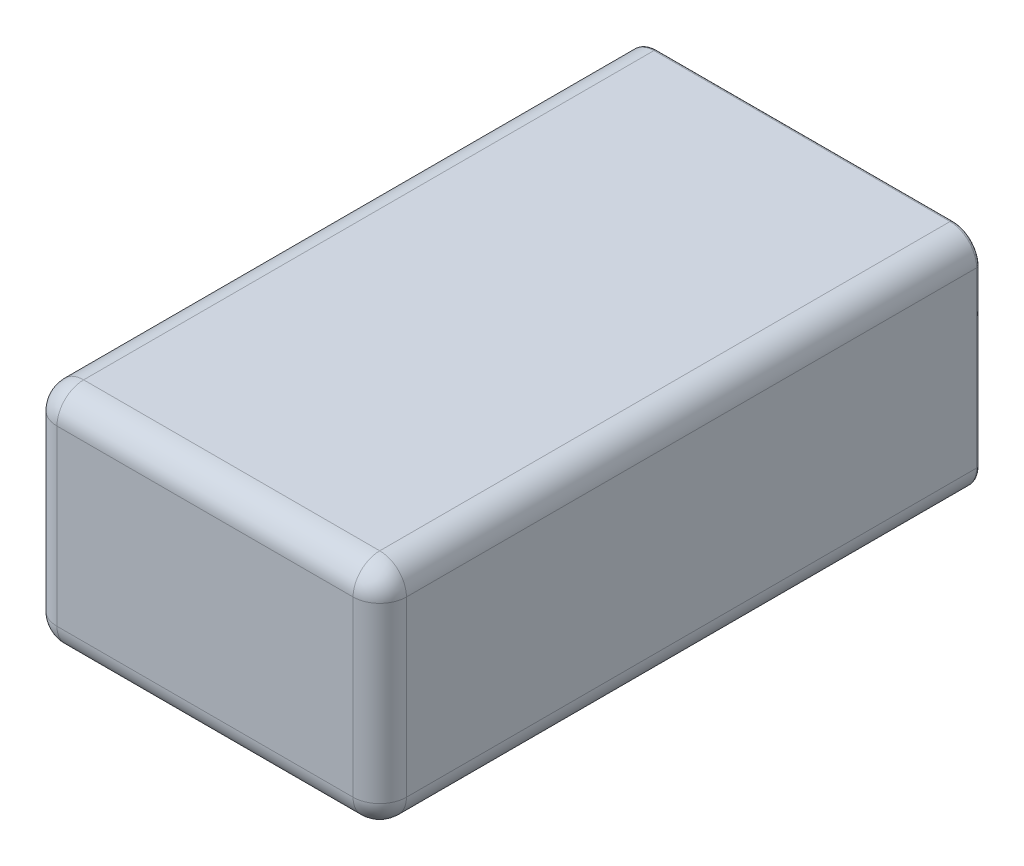
ISO-10303-21;
HEADER;
FILE_DESCRIPTION(('STEP AP214'),'2;1');
FILE_NAME('part.step','',(''),(''),'','','');
FILE_SCHEMA(('AUTOMOTIVE_DESIGN { 1 0 10303 214 1 1 1 1 }'));
ENDSEC;
DATA;
#1=APPLICATION_CONTEXT('core data for automotive mechanical design processes');
#2=APPLICATION_PROTOCOL_DEFINITION('international standard','automotive_design',2000,#1);
#3=PRODUCT_CONTEXT('',#1,'mechanical');
#4=PRODUCT('Part','Part','',(#3));
#5=PRODUCT_RELATED_PRODUCT_CATEGORY('part','',(#4));
#6=PRODUCT_DEFINITION_FORMATION('','',#4);
#7=PRODUCT_DEFINITION_CONTEXT('part definition',#1,'design');
#8=PRODUCT_DEFINITION('design','',#6,#7);
#9=PRODUCT_DEFINITION_SHAPE('','',#8);
#10=(LENGTH_UNIT() NAMED_UNIT(*) SI_UNIT(.MILLI.,.METRE.));
#11=(NAMED_UNIT(*) PLANE_ANGLE_UNIT() SI_UNIT($,.RADIAN.));
#12=(NAMED_UNIT(*) SI_UNIT($,.STERADIAN.) SOLID_ANGLE_UNIT());
#13=UNCERTAINTY_MEASURE_WITH_UNIT(LENGTH_MEASURE(1.E-05),#10,'distance_accuracy_value','');
#14=(GEOMETRIC_REPRESENTATION_CONTEXT(3) GLOBAL_UNCERTAINTY_ASSIGNED_CONTEXT((#13)) GLOBAL_UNIT_ASSIGNED_CONTEXT((#10,
#11,#12)) REPRESENTATION_CONTEXT('',''));
#15=CARTESIAN_POINT('',(0.,0.,0.));
#16=DIRECTION('',(0.,0.,1.));
#17=DIRECTION('',(1.,0.,0.));
#18=AXIS2_PLACEMENT_3D('',#15,#16,#17);
#19=CARTESIAN_POINT('',(-11.1,6.5,45.));
#20=DIRECTION('',(0.,0.,-1.));
#21=DIRECTION('',(-1.,0.,0.));
#22=AXIS2_PLACEMENT_3D('',#19,#20,#21);
#23=CYLINDRICAL_SURFACE('',#22,2.);
#24=DIRECTION('',(0.,0.,-1.));
#25=VECTOR('',#24,1.);
#26=CARTESIAN_POINT('',(-13.1,6.49999999999999,45.));
#27=LINE('',#26,#25);
#28=CARTESIAN_POINT('',(-13.1,6.49999999999999,43.));
#29=VERTEX_POINT('',#28);
#30=CARTESIAN_POINT('',(-13.1,6.49999999999999,0.250000000000014));
#31=VERTEX_POINT('',#30);
#32=EDGE_CURVE('E284',#29,#31,#27,.T.);
#33=ORIENTED_EDGE('',*,*,#32,.F.);
#34=CARTESIAN_POINT('',(-11.1,6.5,43.));
#35=DIRECTION('',(0.,0.,-1.));
#36=DIRECTION('',(-1.,0.,0.));
#37=AXIS2_PLACEMENT_3D('',#34,#35,#36);
#38=CIRCLE('',#37,2.);
#39=CARTESIAN_POINT('',(-11.1,8.5,43.));
#40=VERTEX_POINT('',#39);
#41=EDGE_CURVE('E11',#29,#40,#38,.T.);
#42=ORIENTED_EDGE('',*,*,#41,.T.);
#43=DIRECTION('',(0.,0.,-1.));
#44=VECTOR('',#43,1.);
#45=CARTESIAN_POINT('',(-11.1,8.5,45.));
#46=LINE('',#45,#44);
#47=CARTESIAN_POINT('',(-11.1,8.5,0.250000000000014));
#48=VERTEX_POINT('',#47);
#49=EDGE_CURVE('E254',#40,#48,#46,.T.);
#50=ORIENTED_EDGE('',*,*,#49,.T.);
#51=CARTESIAN_POINT('',(-11.1,6.5,0.25));
#52=DIRECTION('',(0.,0.,1.));
#53=DIRECTION('',(1.,0.,0.));
#54=AXIS2_PLACEMENT_3D('',#51,#52,#53);
#55=CIRCLE('',#54,2.);
#56=EDGE_CURVE('E341',#48,#31,#55,.T.);
#57=ORIENTED_EDGE('',*,*,#56,.T.);
#58=EDGE_LOOP('',(#33,#42,#50,#57));
#59=FACE_BOUND('',#58,.T.);
#60=ADVANCED_FACE('F33',(#59),#23,.T.);
#61=CARTESIAN_POINT('',(-13.1,6.49999999999999,45.));
#62=DIRECTION('',(1.,0.,0.));
#63=DIRECTION('',(0.,0.,-1.));
#64=AXIS2_PLACEMENT_3D('',#61,#62,#63);
#65=PLANE('',#64);
#66=DIRECTION('',(0.,0.,-1.));
#67=VECTOR('',#66,1.);
#68=CARTESIAN_POINT('',(-13.1,-6.49999999999999,45.));
#69=LINE('',#68,#67);
#70=CARTESIAN_POINT('',(-13.1,-6.49999999999999,43.));
#71=VERTEX_POINT('',#70);
#72=CARTESIAN_POINT('',(-13.1,-6.49999999999999,0.250000000000014));
#73=VERTEX_POINT('',#72);
#74=EDGE_CURVE('E282',#71,#73,#69,.T.);
#75=ORIENTED_EDGE('',*,*,#74,.F.);
#76=DIRECTION('',(0.,-1.,0.));
#77=VECTOR('',#76,1.);
#78=CARTESIAN_POINT('',(-13.1,6.49999999999999,43.));
#79=LINE('',#78,#77);
#80=EDGE_CURVE('E42',#71,#29,#79,.F.);
#81=ORIENTED_EDGE('',*,*,#80,.T.);
#82=ORIENTED_EDGE('',*,*,#32,.T.);
#83=DIRECTION('',(0.,-1.,0.));
#84=VECTOR('',#83,1.);
#85=CARTESIAN_POINT('',(-13.1,6.49999999999999,0.25));
#86=LINE('',#85,#84);
#87=EDGE_CURVE('E286',#31,#73,#86,.T.);
#88=ORIENTED_EDGE('',*,*,#87,.T.);
#89=EDGE_LOOP('',(#75,#81,#82,#88));
#90=FACE_BOUND('',#89,.T.);
#91=ADVANCED_FACE('F535',(#90),#65,.F.);
#92=CARTESIAN_POINT('',(-11.1,-6.5,45.));
#93=DIRECTION('',(0.,0.,-1.));
#94=DIRECTION('',(-1.,0.,0.));
#95=AXIS2_PLACEMENT_3D('',#92,#93,#94);
#96=CYLINDRICAL_SURFACE('',#95,2.);
#97=DIRECTION('',(0.,0.,-1.));
#98=VECTOR('',#97,1.);
#99=CARTESIAN_POINT('',(-11.1,-8.5,45.));
#100=LINE('',#99,#98);
#101=CARTESIAN_POINT('',(-11.1,-8.5,43.));
#102=VERTEX_POINT('',#101);
#103=CARTESIAN_POINT('',(-11.1,-8.5,0.250000000000014));
#104=VERTEX_POINT('',#103);
#105=EDGE_CURVE('E280',#102,#104,#100,.T.);
#106=ORIENTED_EDGE('',*,*,#105,.F.);
#107=CARTESIAN_POINT('',(-11.1,-6.5,43.));
#108=DIRECTION('',(0.,0.,-1.));
#109=DIRECTION('',(-1.,0.,0.));
#110=AXIS2_PLACEMENT_3D('',#107,#108,#109);
#111=CIRCLE('',#110,2.);
#112=EDGE_CURVE('E57',#102,#71,#111,.T.);
#113=ORIENTED_EDGE('',*,*,#112,.T.);
#114=ORIENTED_EDGE('',*,*,#74,.T.);
#115=CARTESIAN_POINT('',(-11.1,-6.5,0.25));
#116=DIRECTION('',(0.,0.,1.));
#117=DIRECTION('',(1.,0.,0.));
#118=AXIS2_PLACEMENT_3D('',#115,#116,#117);
#119=CIRCLE('',#118,2.);
#120=EDGE_CURVE('E323',#73,#104,#119,.T.);
#121=ORIENTED_EDGE('',*,*,#120,.T.);
#122=EDGE_LOOP('',(#106,#113,#114,#121));
#123=FACE_BOUND('',#122,.T.);
#124=ADVANCED_FACE('F456',(#123),#96,.T.);
#125=CARTESIAN_POINT('',(-11.1,-8.5,45.));
#126=DIRECTION('',(0.,1.,0.));
#127=DIRECTION('',(-1.,0.,0.));
#128=AXIS2_PLACEMENT_3D('',#125,#126,#127);
#129=PLANE('',#128);
#130=DIRECTION('',(0.,0.,-1.));
#131=VECTOR('',#130,1.);
#132=CARTESIAN_POINT('',(11.1,-8.5,45.));
#133=LINE('',#132,#131);
#134=CARTESIAN_POINT('',(11.1,-8.5,43.));
#135=VERTEX_POINT('',#134);
#136=CARTESIAN_POINT('',(11.1,-8.5,0.250000000000014));
#137=VERTEX_POINT('',#136);
#138=EDGE_CURVE('E278',#135,#137,#133,.T.);
#139=ORIENTED_EDGE('',*,*,#138,.F.);
#140=DIRECTION('',(1.,0.,0.));
#141=VECTOR('',#140,1.);
#142=CARTESIAN_POINT('',(-11.1,-8.5,43.));
#143=LINE('',#142,#141);
#144=EDGE_CURVE('E419',#135,#102,#143,.F.);
#145=ORIENTED_EDGE('',*,*,#144,.T.);
#146=ORIENTED_EDGE('',*,*,#105,.T.);
#147=DIRECTION('',(1.,0.,0.));
#148=VECTOR('',#147,1.);
#149=CARTESIAN_POINT('',(-11.1,-8.5,0.25));
#150=LINE('',#149,#148);
#151=EDGE_CURVE('E326',#104,#137,#150,.T.);
#152=ORIENTED_EDGE('',*,*,#151,.T.);
#153=EDGE_LOOP('',(#139,#145,#146,#152));
#154=FACE_BOUND('',#153,.T.);
#155=ADVANCED_FACE('F455',(#154),#129,.F.);
#156=CARTESIAN_POINT('',(11.1,-6.5,45.));
#157=DIRECTION('',(0.,0.,-1.));
#158=DIRECTION('',(-1.,0.,0.));
#159=AXIS2_PLACEMENT_3D('',#156,#157,#158);
#160=CYLINDRICAL_SURFACE('',#159,2.);
#161=DIRECTION('',(0.,0.,-1.));
#162=VECTOR('',#161,1.);
#163=CARTESIAN_POINT('',(13.1,-6.49999999999998,45.));
#164=LINE('',#163,#162);
#165=CARTESIAN_POINT('',(13.1,-6.49999999999998,43.));
#166=VERTEX_POINT('',#165);
#167=CARTESIAN_POINT('',(13.1,-6.49999999999998,0.250000000000014));
#168=VERTEX_POINT('',#167);
#169=EDGE_CURVE('E276',#166,#168,#164,.T.);
#170=ORIENTED_EDGE('',*,*,#169,.F.);
#171=CARTESIAN_POINT('',(11.1,-6.5,43.));
#172=DIRECTION('',(0.,0.,-1.));
#173=DIRECTION('',(-1.,0.,0.));
#174=AXIS2_PLACEMENT_3D('',#171,#172,#173);
#175=CIRCLE('',#174,2.);
#176=EDGE_CURVE('E417',#166,#135,#175,.T.);
#177=ORIENTED_EDGE('',*,*,#176,.T.);
#178=ORIENTED_EDGE('',*,*,#138,.T.);
#179=CARTESIAN_POINT('',(11.1,-6.5,0.25));
#180=DIRECTION('',(0.,0.,1.));
#181=DIRECTION('',(1.,0.,0.));
#182=AXIS2_PLACEMENT_3D('',#179,#180,#181);
#183=CIRCLE('',#182,2.);
#184=EDGE_CURVE('E329',#137,#168,#183,.T.);
#185=ORIENTED_EDGE('',*,*,#184,.T.);
#186=EDGE_LOOP('',(#170,#177,#178,#185));
#187=FACE_BOUND('',#186,.T.);
#188=ADVANCED_FACE('F502',(#187),#160,.T.);
#189=CARTESIAN_POINT('',(13.1,6.49999999999999,45.));
#190=DIRECTION('',(-1.,0.,0.));
#191=DIRECTION('',(0.,-1.,0.));
#192=AXIS2_PLACEMENT_3D('',#189,#190,#191);
#193=PLANE('',#192);
#194=DIRECTION('',(0.,0.,-1.));
#195=VECTOR('',#194,1.);
#196=CARTESIAN_POINT('',(13.1,6.49999999999999,45.));
#197=LINE('',#196,#195);
#198=CARTESIAN_POINT('',(13.1,6.49999999999999,43.));
#199=VERTEX_POINT('',#198);
#200=CARTESIAN_POINT('',(13.1,6.49999999999999,0.250000000000014));
#201=VERTEX_POINT('',#200);
#202=EDGE_CURVE('E274',#199,#201,#197,.T.);
#203=ORIENTED_EDGE('',*,*,#202,.F.);
#204=DIRECTION('',(0.,1.,0.));
#205=VECTOR('',#204,1.);
#206=CARTESIAN_POINT('',(13.1,-6.49999999999998,43.));
#207=LINE('',#206,#205);
#208=EDGE_CURVE('E415',#199,#166,#207,.F.);
#209=ORIENTED_EDGE('',*,*,#208,.T.);
#210=ORIENTED_EDGE('',*,*,#169,.T.);
#211=DIRECTION('',(0.,1.,0.));
#212=VECTOR('',#211,1.);
#213=CARTESIAN_POINT('',(13.1,6.49999999999999,0.25));
#214=LINE('',#213,#212);
#215=EDGE_CURVE('E332',#168,#201,#214,.T.);
#216=ORIENTED_EDGE('',*,*,#215,.T.);
#217=EDGE_LOOP('',(#203,#209,#210,#216));
#218=FACE_BOUND('',#217,.T.);
#219=ADVANCED_FACE('F505',(#218),#193,.F.);
#220=CARTESIAN_POINT('',(11.1,6.5,45.));
#221=DIRECTION('',(0.,0.,-1.));
#222=DIRECTION('',(-1.,0.,0.));
#223=AXIS2_PLACEMENT_3D('',#220,#221,#222);
#224=CYLINDRICAL_SURFACE('',#223,2.);
#225=DIRECTION('',(0.,0.,-1.));
#226=VECTOR('',#225,1.);
#227=CARTESIAN_POINT('',(11.1,8.5,45.));
#228=LINE('',#227,#226);
#229=CARTESIAN_POINT('',(11.1,8.5,43.));
#230=VERTEX_POINT('',#229);
#231=CARTESIAN_POINT('',(11.1,8.5,0.250000000000014));
#232=VERTEX_POINT('',#231);
#233=EDGE_CURVE('E272',#230,#232,#228,.T.);
#234=ORIENTED_EDGE('',*,*,#233,.F.);
#235=CARTESIAN_POINT('',(11.1,6.5,43.));
#236=DIRECTION('',(0.,0.,-1.));
#237=DIRECTION('',(-1.,0.,0.));
#238=AXIS2_PLACEMENT_3D('',#235,#236,#237);
#239=CIRCLE('',#238,2.);
#240=EDGE_CURVE('E413',#230,#199,#239,.T.);
#241=ORIENTED_EDGE('',*,*,#240,.T.);
#242=ORIENTED_EDGE('',*,*,#202,.T.);
#243=CARTESIAN_POINT('',(11.1,6.5,0.25));
#244=DIRECTION('',(0.,0.,1.));
#245=DIRECTION('',(1.,0.,0.));
#246=AXIS2_PLACEMENT_3D('',#243,#244,#245);
#247=CIRCLE('',#246,2.);
#248=EDGE_CURVE('E335',#201,#232,#247,.T.);
#249=ORIENTED_EDGE('',*,*,#248,.T.);
#250=EDGE_LOOP('',(#234,#241,#242,#249));
#251=FACE_BOUND('',#250,.T.);
#252=ADVANCED_FACE('F822',(#251),#224,.T.);
#253=CARTESIAN_POINT('',(-11.1,8.5,45.));
#254=DIRECTION('',(0.,-1.,0.));
#255=DIRECTION('',(1.,0.,0.));
#256=AXIS2_PLACEMENT_3D('',#253,#254,#255);
#257=PLANE('',#256);
#258=ORIENTED_EDGE('',*,*,#49,.F.);
#259=DIRECTION('',(-1.,0.,0.));
#260=VECTOR('',#259,1.);
#261=CARTESIAN_POINT('',(11.1,8.5,43.));
#262=LINE('',#261,#260);
#263=EDGE_CURVE('E410',#40,#230,#262,.F.);
#264=ORIENTED_EDGE('',*,*,#263,.T.);
#265=ORIENTED_EDGE('',*,*,#233,.T.);
#266=DIRECTION('',(-1.,0.,0.));
#267=VECTOR('',#266,1.);
#268=CARTESIAN_POINT('',(-11.1,8.5,0.25));
#269=LINE('',#268,#267);
#270=EDGE_CURVE('E338',#232,#48,#269,.T.);
#271=ORIENTED_EDGE('',*,*,#270,.T.);
#272=EDGE_LOOP('',(#258,#264,#265,#271));
#273=FACE_BOUND('',#272,.T.);
#274=ADVANCED_FACE('F814',(#273),#257,.F.);
#275=CARTESIAN_POINT('',(-11.1,6.5,45.));
#276=DIRECTION('',(0.,0.,1.));
#277=DIRECTION('',(1.,0.,0.));
#278=AXIS2_PLACEMENT_3D('',#275,#276,#277);
#279=PLANE('',#278);
#280=DIRECTION('',(0.,1.,0.));
#281=VECTOR('',#280,1.);
#282=CARTESIAN_POINT('',(11.1,6.49999999999999,45.));
#283=LINE('',#282,#281);
#284=CARTESIAN_POINT('',(11.1,-6.5,45.));
#285=VERTEX_POINT('',#284);
#286=CARTESIAN_POINT('',(11.1,6.5,45.));
#287=VERTEX_POINT('',#286);
#288=EDGE_CURVE('E405',#285,#287,#283,.T.);
#289=ORIENTED_EDGE('',*,*,#288,.T.);
#290=DIRECTION('',(-1.,0.,0.));
#291=VECTOR('',#290,1.);
#292=CARTESIAN_POINT('',(-11.1,6.5,45.));
#293=LINE('',#292,#291);
#294=CARTESIAN_POINT('',(-11.1,6.49999999999999,45.));
#295=VERTEX_POINT('',#294);
#296=EDGE_CURVE('E407',#287,#295,#293,.T.);
#297=ORIENTED_EDGE('',*,*,#296,.T.);
#298=DIRECTION('',(0.,-1.,0.));
#299=VECTOR('',#298,1.);
#300=CARTESIAN_POINT('',(-11.1,-6.49999999999999,45.));
#301=LINE('',#300,#299);
#302=CARTESIAN_POINT('',(-11.1,-6.5,45.));
#303=VERTEX_POINT('',#302);
#304=EDGE_CURVE('E360',#295,#303,#301,.T.);
#305=ORIENTED_EDGE('',*,*,#304,.T.);
#306=DIRECTION('',(1.,0.,0.));
#307=VECTOR('',#306,1.);
#308=CARTESIAN_POINT('',(11.1,-6.5,45.));
#309=LINE('',#308,#307);
#310=EDGE_CURVE('E403',#303,#285,#309,.T.);
#311=ORIENTED_EDGE('',*,*,#310,.T.);
#312=EDGE_LOOP('',(#289,#297,#305,#311));
#313=FACE_BOUND('',#312,.T.);
#314=ADVANCED_FACE('F520',(#313),#279,.T.);
#315=CARTESIAN_POINT('',(-11.1,6.5,0.));
#316=DIRECTION('',(0.,0.,1.));
#317=DIRECTION('',(1.,0.,0.));
#318=AXIS2_PLACEMENT_3D('',#315,#316,#317);
#319=PLANE('',#318);
#320=CARTESIAN_POINT('',(-11.1,-6.5,0.));
#321=DIRECTION('',(0.,0.,1.));
#322=DIRECTION('',(1.,0.,0.));
#323=AXIS2_PLACEMENT_3D('',#320,#321,#322);
#324=CIRCLE('',#323,1.75);
#325=CARTESIAN_POINT('',(-11.1,-8.25,0.));
#326=VERTEX_POINT('',#325);
#327=CARTESIAN_POINT('',(-12.85,-6.49999999999999,0.));
#328=VERTEX_POINT('',#327);
#329=EDGE_CURVE('E318',#326,#328,#324,.F.);
#330=ORIENTED_EDGE('',*,*,#329,.T.);
#331=DIRECTION('',(0.,-1.,0.));
#332=VECTOR('',#331,1.);
#333=CARTESIAN_POINT('',(-12.85,6.5,0.));
#334=LINE('',#333,#332);
#335=CARTESIAN_POINT('',(-12.85,6.49999999999999,0.));
#336=VERTEX_POINT('',#335);
#337=EDGE_CURVE('E320',#328,#336,#334,.F.);
#338=ORIENTED_EDGE('',*,*,#337,.T.);
#339=CARTESIAN_POINT('',(-11.1,6.5,0.));
#340=DIRECTION('',(0.,0.,1.));
#341=DIRECTION('',(1.,0.,0.));
#342=AXIS2_PLACEMENT_3D('',#339,#340,#341);
#343=CIRCLE('',#342,1.75);
#344=CARTESIAN_POINT('',(-11.1,8.25,0.));
#345=VERTEX_POINT('',#344);
#346=EDGE_CURVE('E306',#336,#345,#343,.F.);
#347=ORIENTED_EDGE('',*,*,#346,.T.);
#348=DIRECTION('',(-1.,0.,0.));
#349=VECTOR('',#348,1.);
#350=CARTESIAN_POINT('',(-11.1,8.25,0.));
#351=LINE('',#350,#349);
#352=CARTESIAN_POINT('',(11.1,8.25,0.));
#353=VERTEX_POINT('',#352);
#354=EDGE_CURVE('E308',#345,#353,#351,.F.);
#355=ORIENTED_EDGE('',*,*,#354,.T.);
#356=CARTESIAN_POINT('',(11.1,6.5,0.));
#357=DIRECTION('',(0.,0.,1.));
#358=DIRECTION('',(1.,0.,0.));
#359=AXIS2_PLACEMENT_3D('',#356,#357,#358);
#360=CIRCLE('',#359,1.75);
#361=CARTESIAN_POINT('',(12.85,6.49999999999999,0.));
#362=VERTEX_POINT('',#361);
#363=EDGE_CURVE('E310',#353,#362,#360,.F.);
#364=ORIENTED_EDGE('',*,*,#363,.T.);
#365=DIRECTION('',(0.,1.,0.));
#366=VECTOR('',#365,1.);
#367=CARTESIAN_POINT('',(12.85,6.50000000000001,0.));
#368=LINE('',#367,#366);
#369=CARTESIAN_POINT('',(12.85,-6.49999999999998,0.));
#370=VERTEX_POINT('',#369);
#371=EDGE_CURVE('E312',#362,#370,#368,.F.);
#372=ORIENTED_EDGE('',*,*,#371,.T.);
#373=CARTESIAN_POINT('',(11.1,-6.5,0.));
#374=DIRECTION('',(0.,0.,1.));
#375=DIRECTION('',(1.,0.,0.));
#376=AXIS2_PLACEMENT_3D('',#373,#374,#375);
#377=CIRCLE('',#376,1.75);
#378=CARTESIAN_POINT('',(11.1,-8.25,0.));
#379=VERTEX_POINT('',#378);
#380=EDGE_CURVE('E314',#370,#379,#377,.F.);
#381=ORIENTED_EDGE('',*,*,#380,.T.);
#382=DIRECTION('',(1.,0.,0.));
#383=VECTOR('',#382,1.);
#384=CARTESIAN_POINT('',(-11.1,-8.25,0.));
#385=LINE('',#384,#383);
#386=EDGE_CURVE('E316',#379,#326,#385,.F.);
#387=ORIENTED_EDGE('',*,*,#386,.T.);
#388=EDGE_LOOP('',(#330,#338,#347,#355,#364,#372,#381,#387));
#389=FACE_BOUND('',#388,.T.);
#390=DIRECTION('',(0.,-1.,0.));
#391=VECTOR('',#390,1.);
#392=CARTESIAN_POINT('',(11.85,6.50000000000001,0.));
#393=LINE('',#392,#391);
#394=CARTESIAN_POINT('',(11.85,-6.49999999999998,0.));
#395=VERTEX_POINT('',#394);
#396=CARTESIAN_POINT('',(11.85,6.5,0.));
#397=VERTEX_POINT('',#396);
#398=EDGE_CURVE('E301',#395,#397,#393,.F.);
#399=ORIENTED_EDGE('',*,*,#398,.T.);
#400=CARTESIAN_POINT('',(11.1,6.5,0.));
#401=DIRECTION('',(0.,0.,1.));
#402=DIRECTION('',(1.,0.,0.));
#403=AXIS2_PLACEMENT_3D('',#400,#401,#402);
#404=CIRCLE('',#403,0.75);
#405=CARTESIAN_POINT('',(11.1,7.25,0.));
#406=VERTEX_POINT('',#405);
#407=EDGE_CURVE('E303',#397,#406,#404,.T.);
#408=ORIENTED_EDGE('',*,*,#407,.T.);
#409=DIRECTION('',(1.,0.,0.));
#410=VECTOR('',#409,1.);
#411=CARTESIAN_POINT('',(-11.1,7.25,0.));
#412=LINE('',#411,#410);
#413=CARTESIAN_POINT('',(-11.1,7.25,0.));
#414=VERTEX_POINT('',#413);
#415=EDGE_CURVE('E289',#406,#414,#412,.F.);
#416=ORIENTED_EDGE('',*,*,#415,.T.);
#417=CARTESIAN_POINT('',(-11.1,6.5,0.));
#418=DIRECTION('',(0.,0.,1.));
#419=DIRECTION('',(1.,0.,0.));
#420=AXIS2_PLACEMENT_3D('',#417,#418,#419);
#421=CIRCLE('',#420,0.75);
#422=CARTESIAN_POINT('',(-11.85,6.5,0.));
#423=VERTEX_POINT('',#422);
#424=EDGE_CURVE('E291',#414,#423,#421,.T.);
#425=ORIENTED_EDGE('',*,*,#424,.T.);
#426=DIRECTION('',(0.,1.,0.));
#427=VECTOR('',#426,1.);
#428=CARTESIAN_POINT('',(-11.85,6.5,0.));
#429=LINE('',#428,#427);
#430=CARTESIAN_POINT('',(-11.85,-6.5,0.));
#431=VERTEX_POINT('',#430);
#432=EDGE_CURVE('E293',#423,#431,#429,.F.);
#433=ORIENTED_EDGE('',*,*,#432,.T.);
#434=CARTESIAN_POINT('',(-11.1,-6.5,0.));
#435=DIRECTION('',(0.,0.,1.));
#436=DIRECTION('',(1.,0.,0.));
#437=AXIS2_PLACEMENT_3D('',#434,#435,#436);
#438=CIRCLE('',#437,0.75);
#439=CARTESIAN_POINT('',(-11.1,-7.25,0.));
#440=VERTEX_POINT('',#439);
#441=EDGE_CURVE('E295',#431,#440,#438,.T.);
#442=ORIENTED_EDGE('',*,*,#441,.T.);
#443=DIRECTION('',(-1.,0.,0.));
#444=VECTOR('',#443,1.);
#445=CARTESIAN_POINT('',(-11.1,-7.25,0.));
#446=LINE('',#445,#444);
#447=CARTESIAN_POINT('',(11.1,-7.25,0.));
#448=VERTEX_POINT('',#447);
#449=EDGE_CURVE('E297',#440,#448,#446,.F.);
#450=ORIENTED_EDGE('',*,*,#449,.T.);
#451=CARTESIAN_POINT('',(11.1,-6.5,0.));
#452=DIRECTION('',(0.,0.,1.));
#453=DIRECTION('',(1.,0.,0.));
#454=AXIS2_PLACEMENT_3D('',#451,#452,#453);
#455=CIRCLE('',#454,0.75);
#456=EDGE_CURVE('E299',#448,#395,#455,.T.);
#457=ORIENTED_EDGE('',*,*,#456,.T.);
#458=EDGE_LOOP('',(#399,#408,#416,#425,#433,#442,#450,#457));
#459=FACE_BOUND('',#458,.T.);
#460=ADVANCED_FACE('F471',(#389,#459),#319,.F.);
#461=CARTESIAN_POINT('',(-11.1,6.5,0.5));
#462=DIRECTION('',(0.,0.,-1.));
#463=DIRECTION('',(-1.,0.,0.));
#464=AXIS2_PLACEMENT_3D('',#461,#462,#463);
#465=CYLINDRICAL_SURFACE('',#464,0.5);
#466=DIRECTION('',(0.,0.,-1.));
#467=VECTOR('',#466,1.);
#468=CARTESIAN_POINT('',(-11.6,6.5,0.5));
#469=LINE('',#468,#467);
#470=CARTESIAN_POINT('',(-11.6,6.5,0.5));
#471=VERTEX_POINT('',#470);
#472=CARTESIAN_POINT('',(-11.6,6.5,0.25));
#473=VERTEX_POINT('',#472);
#474=EDGE_CURVE('E252',#471,#473,#469,.T.);
#475=ORIENTED_EDGE('',*,*,#474,.T.);
#476=CARTESIAN_POINT('',(-11.1,6.5,0.25));
#477=DIRECTION('',(0.,0.,1.));
#478=DIRECTION('',(1.,0.,0.));
#479=AXIS2_PLACEMENT_3D('',#476,#477,#478);
#480=CIRCLE('',#479,0.5);
#481=CARTESIAN_POINT('',(-11.1,7.,0.25));
#482=VERTEX_POINT('',#481);
#483=EDGE_CURVE('E215',#473,#482,#480,.F.);
#484=ORIENTED_EDGE('',*,*,#483,.T.);
#485=DIRECTION('',(0.,0.,-1.));
#486=VECTOR('',#485,1.);
#487=CARTESIAN_POINT('',(-11.1,7.,0.5));
#488=LINE('',#487,#486);
#489=CARTESIAN_POINT('',(-11.1,7.,0.5));
#490=VERTEX_POINT('',#489);
#491=EDGE_CURVE('E207',#490,#482,#488,.T.);
#492=ORIENTED_EDGE('',*,*,#491,.F.);
#493=CARTESIAN_POINT('',(-11.1,6.5,0.5));
#494=DIRECTION('',(0.,0.,-1.));
#495=DIRECTION('',(-1.,0.,0.));
#496=AXIS2_PLACEMENT_3D('',#493,#494,#495);
#497=CIRCLE('',#496,0.5);
#498=EDGE_CURVE('E212',#471,#490,#497,.T.);
#499=ORIENTED_EDGE('',*,*,#498,.F.);
#500=EDGE_LOOP('',(#475,#484,#492,#499));
#501=FACE_BOUND('',#500,.T.);
#502=ADVANCED_FACE('F210',(#501),#465,.F.);
#503=CARTESIAN_POINT('',(-11.6,-6.5,0.5));
#504=DIRECTION('',(-1.,0.,0.));
#505=DIRECTION('',(0.,0.,1.));
#506=AXIS2_PLACEMENT_3D('',#503,#504,#505);
#507=PLANE('',#506);
#508=DIRECTION('',(0.,0.,-1.));
#509=VECTOR('',#508,1.);
#510=CARTESIAN_POINT('',(-11.6,-6.5,0.5));
#511=LINE('',#510,#509);
#512=CARTESIAN_POINT('',(-11.6,-6.5,0.5));
#513=VERTEX_POINT('',#512);
#514=CARTESIAN_POINT('',(-11.6,-6.5,0.25));
#515=VERTEX_POINT('',#514);
#516=EDGE_CURVE('E255',#513,#515,#511,.T.);
#517=ORIENTED_EDGE('',*,*,#516,.T.);
#518=DIRECTION('',(0.,1.,0.));
#519=VECTOR('',#518,1.);
#520=CARTESIAN_POINT('',(-11.6,-6.5,0.25));
#521=LINE('',#520,#519);
#522=EDGE_CURVE('E355',#515,#473,#521,.T.);
#523=ORIENTED_EDGE('',*,*,#522,.T.);
#524=ORIENTED_EDGE('',*,*,#474,.F.);
#525=DIRECTION('',(0.,1.,0.));
#526=VECTOR('',#525,1.);
#527=CARTESIAN_POINT('',(-11.6,-6.5,0.5));
#528=LINE('',#527,#526);
#529=EDGE_CURVE('E219',#513,#471,#528,.T.);
#530=ORIENTED_EDGE('',*,*,#529,.F.);
#531=EDGE_LOOP('',(#517,#523,#524,#530));
#532=FACE_BOUND('',#531,.T.);
#533=ADVANCED_FACE('F785',(#532),#507,.F.);
#534=CARTESIAN_POINT('',(-11.1,-6.5,0.5));
#535=DIRECTION('',(0.,0.,-1.));
#536=DIRECTION('',(-1.,0.,0.));
#537=AXIS2_PLACEMENT_3D('',#534,#535,#536);
#538=CYLINDRICAL_SURFACE('',#537,0.5);
#539=DIRECTION('',(0.,0.,-1.));
#540=VECTOR('',#539,1.);
#541=CARTESIAN_POINT('',(-11.1,-7.,0.5));
#542=LINE('',#541,#540);
#543=CARTESIAN_POINT('',(-11.1,-7.,0.5));
#544=VERTEX_POINT('',#543);
#545=CARTESIAN_POINT('',(-11.1,-7.,0.25));
#546=VERTEX_POINT('',#545);
#547=EDGE_CURVE('E258',#544,#546,#542,.T.);
#548=ORIENTED_EDGE('',*,*,#547,.T.);
#549=CARTESIAN_POINT('',(-11.1,-6.5,0.25));
#550=DIRECTION('',(0.,0.,1.));
#551=DIRECTION('',(1.,0.,0.));
#552=AXIS2_PLACEMENT_3D('',#549,#550,#551);
#553=CIRCLE('',#552,0.5);
#554=EDGE_CURVE('E353',#546,#515,#553,.F.);
#555=ORIENTED_EDGE('',*,*,#554,.T.);
#556=ORIENTED_EDGE('',*,*,#516,.F.);
#557=CARTESIAN_POINT('',(-11.1,-6.5,0.5));
#558=DIRECTION('',(0.,0.,-1.));
#559=DIRECTION('',(-1.,0.,0.));
#560=AXIS2_PLACEMENT_3D('',#557,#558,#559);
#561=CIRCLE('',#560,0.5);
#562=EDGE_CURVE('E249',#544,#513,#561,.T.);
#563=ORIENTED_EDGE('',*,*,#562,.F.);
#564=EDGE_LOOP('',(#548,#555,#556,#563));
#565=FACE_BOUND('',#564,.T.);
#566=ADVANCED_FACE('F776',(#565),#538,.F.);
#567=CARTESIAN_POINT('',(11.1,-7.,0.5));
#568=DIRECTION('',(0.,-1.,0.));
#569=DIRECTION('',(1.,0.,0.));
#570=AXIS2_PLACEMENT_3D('',#567,#568,#569);
#571=PLANE('',#570);
#572=DIRECTION('',(0.,0.,-1.));
#573=VECTOR('',#572,1.);
#574=CARTESIAN_POINT('',(11.1,-7.,0.5));
#575=LINE('',#574,#573);
#576=CARTESIAN_POINT('',(11.1,-7.,0.5));
#577=VERTEX_POINT('',#576);
#578=CARTESIAN_POINT('',(11.1,-7.,0.25));
#579=VERTEX_POINT('',#578);
#580=EDGE_CURVE('E261',#577,#579,#575,.T.);
#581=ORIENTED_EDGE('',*,*,#580,.T.);
#582=DIRECTION('',(-1.,0.,0.));
#583=VECTOR('',#582,1.);
#584=CARTESIAN_POINT('',(11.1,-7.,0.25));
#585=LINE('',#584,#583);
#586=EDGE_CURVE('E351',#579,#546,#585,.T.);
#587=ORIENTED_EDGE('',*,*,#586,.T.);
#588=ORIENTED_EDGE('',*,*,#547,.F.);
#589=DIRECTION('',(-1.,0.,0.));
#590=VECTOR('',#589,1.);
#591=CARTESIAN_POINT('',(11.1,-7.,0.5));
#592=LINE('',#591,#590);
#593=EDGE_CURVE('E246',#577,#544,#592,.T.);
#594=ORIENTED_EDGE('',*,*,#593,.F.);
#595=EDGE_LOOP('',(#581,#587,#588,#594));
#596=FACE_BOUND('',#595,.T.);
#597=ADVANCED_FACE('F767',(#596),#571,.F.);
#598=CARTESIAN_POINT('',(11.1,-6.5,0.5));
#599=DIRECTION('',(0.,0.,-1.));
#600=DIRECTION('',(-1.,0.,0.));
#601=AXIS2_PLACEMENT_3D('',#598,#599,#600);
#602=CYLINDRICAL_SURFACE('',#601,0.5);
#603=DIRECTION('',(0.,0.,-1.));
#604=VECTOR('',#603,1.);
#605=CARTESIAN_POINT('',(11.6,-6.49999999999998,0.5));
#606=LINE('',#605,#604);
#607=CARTESIAN_POINT('',(11.6,-6.49999999999998,0.5));
#608=VERTEX_POINT('',#607);
#609=CARTESIAN_POINT('',(11.6,-6.49999999999998,0.25));
#610=VERTEX_POINT('',#609);
#611=EDGE_CURVE('E264',#608,#610,#606,.T.);
#612=ORIENTED_EDGE('',*,*,#611,.T.);
#613=CARTESIAN_POINT('',(11.1,-6.5,0.25));
#614=DIRECTION('',(0.,0.,1.));
#615=DIRECTION('',(1.,0.,0.));
#616=AXIS2_PLACEMENT_3D('',#613,#614,#615);
#617=CIRCLE('',#616,0.5);
#618=EDGE_CURVE('E349',#610,#579,#617,.F.);
#619=ORIENTED_EDGE('',*,*,#618,.T.);
#620=ORIENTED_EDGE('',*,*,#580,.F.);
#621=CARTESIAN_POINT('',(11.1,-6.5,0.5));
#622=DIRECTION('',(0.,0.,-1.));
#623=DIRECTION('',(-1.,0.,0.));
#624=AXIS2_PLACEMENT_3D('',#621,#622,#623);
#625=CIRCLE('',#624,0.5);
#626=EDGE_CURVE('E243',#608,#577,#625,.T.);
#627=ORIENTED_EDGE('',*,*,#626,.F.);
#628=EDGE_LOOP('',(#612,#619,#620,#627));
#629=FACE_BOUND('',#628,.T.);
#630=ADVANCED_FACE('F758',(#629),#602,.F.);
#631=CARTESIAN_POINT('',(11.6,6.5,0.5));
#632=DIRECTION('',(1.,0.,0.));
#633=DIRECTION('',(0.,1.,0.));
#634=AXIS2_PLACEMENT_3D('',#631,#632,#633);
#635=PLANE('',#634);
#636=DIRECTION('',(0.,0.,-1.));
#637=VECTOR('',#636,1.);
#638=CARTESIAN_POINT('',(11.6,6.5,0.5));
#639=LINE('',#638,#637);
#640=CARTESIAN_POINT('',(11.6,6.5,0.5));
#641=VERTEX_POINT('',#640);
#642=CARTESIAN_POINT('',(11.6,6.5,0.25));
#643=VERTEX_POINT('',#642);
#644=EDGE_CURVE('E267',#641,#643,#639,.T.);
#645=ORIENTED_EDGE('',*,*,#644,.T.);
#646=DIRECTION('',(0.,-1.,0.));
#647=VECTOR('',#646,1.);
#648=CARTESIAN_POINT('',(11.6,6.5,0.25));
#649=LINE('',#648,#647);
#650=EDGE_CURVE('E347',#643,#610,#649,.T.);
#651=ORIENTED_EDGE('',*,*,#650,.T.);
#652=ORIENTED_EDGE('',*,*,#611,.F.);
#653=DIRECTION('',(0.,-1.,0.));
#654=VECTOR('',#653,1.);
#655=CARTESIAN_POINT('',(11.6,6.5,0.5));
#656=LINE('',#655,#654);
#657=EDGE_CURVE('E240',#641,#608,#656,.T.);
#658=ORIENTED_EDGE('',*,*,#657,.F.);
#659=EDGE_LOOP('',(#645,#651,#652,#658));
#660=FACE_BOUND('',#659,.T.);
#661=ADVANCED_FACE('F749',(#660),#635,.F.);
#662=CARTESIAN_POINT('',(11.1,6.5,0.5));
#663=DIRECTION('',(0.,0.,-1.));
#664=DIRECTION('',(-1.,0.,0.));
#665=AXIS2_PLACEMENT_3D('',#662,#663,#664);
#666=CYLINDRICAL_SURFACE('',#665,0.5);
#667=DIRECTION('',(0.,0.,-1.));
#668=VECTOR('',#667,1.);
#669=CARTESIAN_POINT('',(11.1,7.,0.5));
#670=LINE('',#669,#668);
#671=CARTESIAN_POINT('',(11.1,7.,0.5));
#672=VERTEX_POINT('',#671);
#673=CARTESIAN_POINT('',(11.1,7.,0.25));
#674=VERTEX_POINT('',#673);
#675=EDGE_CURVE('E218',#672,#674,#670,.T.);
#676=ORIENTED_EDGE('',*,*,#675,.T.);
#677=CARTESIAN_POINT('',(11.1,6.5,0.25));
#678=DIRECTION('',(0.,0.,1.));
#679=DIRECTION('',(1.,0.,0.));
#680=AXIS2_PLACEMENT_3D('',#677,#678,#679);
#681=CIRCLE('',#680,0.5);
#682=EDGE_CURVE('E344',#674,#643,#681,.F.);
#683=ORIENTED_EDGE('',*,*,#682,.T.);
#684=ORIENTED_EDGE('',*,*,#644,.F.);
#685=CARTESIAN_POINT('',(11.1,6.5,0.5));
#686=DIRECTION('',(0.,0.,-1.));
#687=DIRECTION('',(-1.,0.,0.));
#688=AXIS2_PLACEMENT_3D('',#685,#686,#687);
#689=CIRCLE('',#688,0.5);
#690=EDGE_CURVE('E228',#672,#641,#689,.T.);
#691=ORIENTED_EDGE('',*,*,#690,.F.);
#692=EDGE_LOOP('',(#676,#683,#684,#691));
#693=FACE_BOUND('',#692,.T.);
#694=ADVANCED_FACE('F741',(#693),#666,.F.);
#695=CARTESIAN_POINT('',(-11.1,7.,0.5));
#696=DIRECTION('',(0.,1.,0.));
#697=DIRECTION('',(-1.,0.,0.));
#698=AXIS2_PLACEMENT_3D('',#695,#696,#697);
#699=PLANE('',#698);
#700=ORIENTED_EDGE('',*,*,#491,.T.);
#701=DIRECTION('',(1.,0.,0.));
#702=VECTOR('',#701,1.);
#703=CARTESIAN_POINT('',(-11.1,7.,0.25));
#704=LINE('',#703,#702);
#705=EDGE_CURVE('E358',#482,#674,#704,.T.);
#706=ORIENTED_EDGE('',*,*,#705,.T.);
#707=ORIENTED_EDGE('',*,*,#675,.F.);
#708=DIRECTION('',(1.,0.,0.));
#709=VECTOR('',#708,1.);
#710=CARTESIAN_POINT('',(-11.1,7.,0.5));
#711=LINE('',#710,#709);
#712=EDGE_CURVE('E222',#490,#672,#711,.T.);
#713=ORIENTED_EDGE('',*,*,#712,.F.);
#714=EDGE_LOOP('',(#700,#706,#707,#713));
#715=FACE_BOUND('',#714,.T.);
#716=ADVANCED_FACE('F223',(#715),#699,.F.);
#717=CARTESIAN_POINT('',(-11.1,6.5,0.5));
#718=DIRECTION('',(0.,0.,-1.));
#719=DIRECTION('',(-1.,0.,0.));
#720=AXIS2_PLACEMENT_3D('',#717,#718,#719);
#721=PLANE('',#720);
#722=ORIENTED_EDGE('',*,*,#498,.T.);
#723=ORIENTED_EDGE('',*,*,#712,.T.);
#724=ORIENTED_EDGE('',*,*,#690,.T.);
#725=ORIENTED_EDGE('',*,*,#657,.T.);
#726=ORIENTED_EDGE('',*,*,#626,.T.);
#727=ORIENTED_EDGE('',*,*,#593,.T.);
#728=ORIENTED_EDGE('',*,*,#562,.T.);
#729=ORIENTED_EDGE('',*,*,#529,.T.);
#730=EDGE_LOOP('',(#722,#723,#724,#725,#726,#727,#728,#729));
#731=FACE_BOUND('',#730,.T.);
#732=ADVANCED_FACE('F230',(#731),#721,.T.);
#733=CARTESIAN_POINT('',(12.85,6.49999999999999,0.25));
#734=DIRECTION('',(0.,1.,0.));
#735=DIRECTION('',(-1.,0.,0.));
#736=AXIS2_PLACEMENT_3D('',#733,#734,#735);
#737=CYLINDRICAL_SURFACE('',#736,0.25);
#738=CARTESIAN_POINT('',(12.85,-6.49999999999998,0.25));
#739=DIRECTION('',(0.,-1.,0.));
#740=DIRECTION('',(1.,0.,0.));
#741=AXIS2_PLACEMENT_3D('',#738,#739,#740);
#742=CIRCLE('',#741,0.25);
#743=EDGE_CURVE('E236',#370,#168,#742,.T.);
#744=ORIENTED_EDGE('',*,*,#743,.F.);
#745=ORIENTED_EDGE('',*,*,#371,.F.);
#746=CARTESIAN_POINT('',(12.85,6.49999999999999,0.25));
#747=DIRECTION('',(0.,1.,0.));
#748=DIRECTION('',(0.,0.,1.));
#749=AXIS2_PLACEMENT_3D('',#746,#747,#748);
#750=CIRCLE('',#749,0.25);
#751=EDGE_CURVE('E233',#201,#362,#750,.T.);
#752=ORIENTED_EDGE('',*,*,#751,.F.);
#753=ORIENTED_EDGE('',*,*,#215,.F.);
#754=EDGE_LOOP('',(#744,#745,#752,#753));
#755=FACE_BOUND('',#754,.T.);
#756=ADVANCED_FACE('F495',(#755),#737,.T.);
#757=CARTESIAN_POINT('',(11.1,6.5,0.25));
#758=DIRECTION('',(0.,0.,1.));
#759=DIRECTION('',(1.,0.,0.));
#760=AXIS2_PLACEMENT_3D('',#757,#758,#759);
#761=TOROIDAL_SURFACE('',#760,1.75,0.25);
#762=ORIENTED_EDGE('',*,*,#751,.T.);
#763=ORIENTED_EDGE('',*,*,#363,.F.);
#764=CARTESIAN_POINT('',(11.1,8.25,0.25));
#765=DIRECTION('',(-1.,0.,0.));
#766=DIRECTION('',(0.,-1.,0.));
#767=AXIS2_PLACEMENT_3D('',#764,#765,#766);
#768=CIRCLE('',#767,0.25);
#769=EDGE_CURVE('E376',#232,#353,#768,.T.);
#770=ORIENTED_EDGE('',*,*,#769,.F.);
#771=ORIENTED_EDGE('',*,*,#248,.F.);
#772=EDGE_LOOP('',(#762,#763,#770,#771));
#773=FACE_BOUND('',#772,.T.);
#774=ADVANCED_FACE('F490',(#773),#761,.T.);
#775=CARTESIAN_POINT('',(11.1,-6.5,0.25));
#776=DIRECTION('',(0.,0.,1.));
#777=DIRECTION('',(1.,0.,0.));
#778=AXIS2_PLACEMENT_3D('',#775,#776,#777);
#779=TOROIDAL_SURFACE('',#778,1.75,0.25);
#780=ORIENTED_EDGE('',*,*,#743,.T.);
#781=ORIENTED_EDGE('',*,*,#184,.F.);
#782=CARTESIAN_POINT('',(11.1,-8.25,0.25));
#783=DIRECTION('',(-1.,0.,0.));
#784=DIRECTION('',(0.,0.,1.));
#785=AXIS2_PLACEMENT_3D('',#782,#783,#784);
#786=CIRCLE('',#785,0.25);
#787=EDGE_CURVE('E373',#379,#137,#786,.T.);
#788=ORIENTED_EDGE('',*,*,#787,.F.);
#789=ORIENTED_EDGE('',*,*,#380,.F.);
#790=EDGE_LOOP('',(#780,#781,#788,#789));
#791=FACE_BOUND('',#790,.T.);
#792=ADVANCED_FACE('F499',(#791),#779,.T.);
#793=CARTESIAN_POINT('',(-11.1,8.25,0.25));
#794=DIRECTION('',(-1.,0.,0.));
#795=DIRECTION('',(0.,-1.,0.));
#796=AXIS2_PLACEMENT_3D('',#793,#794,#795);
#797=CYLINDRICAL_SURFACE('',#796,0.25);
#798=ORIENTED_EDGE('',*,*,#769,.T.);
#799=ORIENTED_EDGE('',*,*,#354,.F.);
#800=CARTESIAN_POINT('',(-11.1,8.25,0.25));
#801=DIRECTION('',(-1.,0.,0.));
#802=DIRECTION('',(0.,0.,1.));
#803=AXIS2_PLACEMENT_3D('',#800,#801,#802);
#804=CIRCLE('',#803,0.25);
#805=EDGE_CURVE('E370',#48,#345,#804,.T.);
#806=ORIENTED_EDGE('',*,*,#805,.F.);
#807=ORIENTED_EDGE('',*,*,#270,.F.);
#808=EDGE_LOOP('',(#798,#799,#806,#807));
#809=FACE_BOUND('',#808,.T.);
#810=ADVANCED_FACE('F485',(#809),#797,.T.);
#811=CARTESIAN_POINT('',(-11.1,-8.25,0.25));
#812=DIRECTION('',(1.,0.,0.));
#813=DIRECTION('',(0.,1.,0.));
#814=AXIS2_PLACEMENT_3D('',#811,#812,#813);
#815=CYLINDRICAL_SURFACE('',#814,0.25);
#816=ORIENTED_EDGE('',*,*,#787,.T.);
#817=ORIENTED_EDGE('',*,*,#151,.F.);
#818=CARTESIAN_POINT('',(-11.1,-8.25,0.25));
#819=DIRECTION('',(-1.,0.,0.));
#820=DIRECTION('',(0.,-1.,0.));
#821=AXIS2_PLACEMENT_3D('',#818,#819,#820);
#822=CIRCLE('',#821,0.25);
#823=EDGE_CURVE('E367',#326,#104,#822,.T.);
#824=ORIENTED_EDGE('',*,*,#823,.F.);
#825=ORIENTED_EDGE('',*,*,#386,.F.);
#826=EDGE_LOOP('',(#816,#817,#824,#825));
#827=FACE_BOUND('',#826,.T.);
#828=ADVANCED_FACE('F463',(#827),#815,.T.);
#829=CARTESIAN_POINT('',(-11.1,6.5,0.25));
#830=DIRECTION('',(0.,0.,1.));
#831=DIRECTION('',(1.,0.,0.));
#832=AXIS2_PLACEMENT_3D('',#829,#830,#831);
#833=TOROIDAL_SURFACE('',#832,1.75,0.25);
#834=ORIENTED_EDGE('',*,*,#805,.T.);
#835=ORIENTED_EDGE('',*,*,#346,.F.);
#836=CARTESIAN_POINT('',(-12.85,6.49999999999999,0.25));
#837=DIRECTION('',(0.,-1.,0.));
#838=DIRECTION('',(0.,0.,-1.));
#839=AXIS2_PLACEMENT_3D('',#836,#837,#838);
#840=CIRCLE('',#839,0.25);
#841=EDGE_CURVE('E364',#31,#336,#840,.T.);
#842=ORIENTED_EDGE('',*,*,#841,.F.);
#843=ORIENTED_EDGE('',*,*,#56,.F.);
#844=EDGE_LOOP('',(#834,#835,#842,#843));
#845=FACE_BOUND('',#844,.T.);
#846=ADVANCED_FACE('F480',(#845),#833,.T.);
#847=CARTESIAN_POINT('',(-11.1,-6.5,0.25));
#848=DIRECTION('',(0.,0.,1.));
#849=DIRECTION('',(1.,0.,0.));
#850=AXIS2_PLACEMENT_3D('',#847,#848,#849);
#851=TOROIDAL_SURFACE('',#850,1.75,0.25);
#852=ORIENTED_EDGE('',*,*,#823,.T.);
#853=ORIENTED_EDGE('',*,*,#120,.F.);
#854=CARTESIAN_POINT('',(-12.85,-6.49999999999999,0.25));
#855=DIRECTION('',(0.,1.,0.));
#856=DIRECTION('',(0.,0.,1.));
#857=AXIS2_PLACEMENT_3D('',#854,#855,#856);
#858=CIRCLE('',#857,0.25);
#859=EDGE_CURVE('E361',#328,#73,#858,.T.);
#860=ORIENTED_EDGE('',*,*,#859,.F.);
#861=ORIENTED_EDGE('',*,*,#329,.F.);
#862=EDGE_LOOP('',(#852,#853,#860,#861));
#863=FACE_BOUND('',#862,.T.);
#864=ADVANCED_FACE('F468',(#863),#851,.T.);
#865=CARTESIAN_POINT('',(-12.85,6.49999999999999,0.25));
#866=DIRECTION('',(0.,-1.,0.));
#867=DIRECTION('',(0.,0.,-1.));
#868=AXIS2_PLACEMENT_3D('',#865,#866,#867);
#869=CYLINDRICAL_SURFACE('',#868,0.25);
#870=ORIENTED_EDGE('',*,*,#841,.T.);
#871=ORIENTED_EDGE('',*,*,#337,.F.);
#872=ORIENTED_EDGE('',*,*,#859,.T.);
#873=ORIENTED_EDGE('',*,*,#87,.F.);
#874=EDGE_LOOP('',(#870,#871,#872,#873));
#875=FACE_BOUND('',#874,.T.);
#876=ADVANCED_FACE('F474',(#875),#869,.T.);
#877=CARTESIAN_POINT('',(-11.1,-6.5,0.25));
#878=DIRECTION('',(0.,0.,1.));
#879=DIRECTION('',(1.,0.,0.));
#880=AXIS2_PLACEMENT_3D('',#877,#878,#879);
#881=TOROIDAL_SURFACE('',#880,0.75,0.25);
#882=CARTESIAN_POINT('',(-11.1,-7.25,0.25));
#883=DIRECTION('',(1.,0.,0.));
#884=DIRECTION('',(0.,0.,-1.));
#885=AXIS2_PLACEMENT_3D('',#882,#883,#884);
#886=CIRCLE('',#885,0.25);
#887=EDGE_CURVE('E397',#440,#546,#886,.T.);
#888=ORIENTED_EDGE('',*,*,#887,.F.);
#889=ORIENTED_EDGE('',*,*,#441,.F.);
#890=CARTESIAN_POINT('',(-11.85,-6.5,0.25));
#891=DIRECTION('',(0.,1.,0.));
#892=DIRECTION('',(0.,0.,1.));
#893=AXIS2_PLACEMENT_3D('',#890,#891,#892);
#894=CIRCLE('',#893,0.25);
#895=EDGE_CURVE('E365',#515,#431,#894,.T.);
#896=ORIENTED_EDGE('',*,*,#895,.F.);
#897=ORIENTED_EDGE('',*,*,#554,.F.);
#898=EDGE_LOOP('',(#888,#889,#896,#897));
#899=FACE_BOUND('',#898,.T.);
#900=ADVANCED_FACE('F546',(#899),#881,.T.);
#901=CARTESIAN_POINT('',(-11.85,-6.5,0.25));
#902=DIRECTION('',(0.,1.,0.));
#903=DIRECTION('',(0.,0.,1.));
#904=AXIS2_PLACEMENT_3D('',#901,#902,#903);
#905=CYLINDRICAL_SURFACE('',#904,0.25);
#906=ORIENTED_EDGE('',*,*,#895,.T.);
#907=ORIENTED_EDGE('',*,*,#432,.F.);
#908=CARTESIAN_POINT('',(-11.85,6.5,0.25));
#909=DIRECTION('',(0.,1.,0.));
#910=DIRECTION('',(0.,0.,1.));
#911=AXIS2_PLACEMENT_3D('',#908,#909,#910);
#912=CIRCLE('',#911,0.25);
#913=EDGE_CURVE('E394',#473,#423,#912,.T.);
#914=ORIENTED_EDGE('',*,*,#913,.F.);
#915=ORIENTED_EDGE('',*,*,#522,.F.);
#916=EDGE_LOOP('',(#906,#907,#914,#915));
#917=FACE_BOUND('',#916,.T.);
#918=ADVANCED_FACE('F584',(#917),#905,.T.);
#919=CARTESIAN_POINT('',(11.1,-7.25,0.25));
#920=DIRECTION('',(-1.,0.,0.));
#921=DIRECTION('',(0.,-1.,0.));
#922=AXIS2_PLACEMENT_3D('',#919,#920,#921);
#923=CYLINDRICAL_SURFACE('',#922,0.25);
#924=ORIENTED_EDGE('',*,*,#887,.T.);
#925=ORIENTED_EDGE('',*,*,#586,.F.);
#926=CARTESIAN_POINT('',(11.1,-7.25,0.25));
#927=DIRECTION('',(1.,0.,0.));
#928=DIRECTION('',(0.,1.,0.));
#929=AXIS2_PLACEMENT_3D('',#926,#927,#928);
#930=CIRCLE('',#929,0.25);
#931=EDGE_CURVE('E391',#448,#579,#930,.T.);
#932=ORIENTED_EDGE('',*,*,#931,.F.);
#933=ORIENTED_EDGE('',*,*,#449,.F.);
#934=EDGE_LOOP('',(#924,#925,#932,#933));
#935=FACE_BOUND('',#934,.T.);
#936=ADVANCED_FACE('F580',(#935),#923,.T.);
#937=CARTESIAN_POINT('',(-11.1,6.5,0.25));
#938=DIRECTION('',(0.,0.,1.));
#939=DIRECTION('',(1.,0.,0.));
#940=AXIS2_PLACEMENT_3D('',#937,#938,#939);
#941=TOROIDAL_SURFACE('',#940,0.75,0.25);
#942=ORIENTED_EDGE('',*,*,#913,.T.);
#943=ORIENTED_EDGE('',*,*,#424,.F.);
#944=CARTESIAN_POINT('',(-11.1,7.25,0.25));
#945=DIRECTION('',(1.,0.,0.));
#946=DIRECTION('',(0.,1.,0.));
#947=AXIS2_PLACEMENT_3D('',#944,#945,#946);
#948=CIRCLE('',#947,0.25);
#949=EDGE_CURVE('E388',#482,#414,#948,.T.);
#950=ORIENTED_EDGE('',*,*,#949,.F.);
#951=ORIENTED_EDGE('',*,*,#483,.F.);
#952=EDGE_LOOP('',(#942,#943,#950,#951));
#953=FACE_BOUND('',#952,.T.);
#954=ADVANCED_FACE('F576',(#953),#941,.T.);
#955=CARTESIAN_POINT('',(11.1,-6.5,0.25));
#956=DIRECTION('',(0.,0.,1.));
#957=DIRECTION('',(1.,0.,0.));
#958=AXIS2_PLACEMENT_3D('',#955,#956,#957);
#959=TOROIDAL_SURFACE('',#958,0.75,0.25);
#960=ORIENTED_EDGE('',*,*,#931,.T.);
#961=ORIENTED_EDGE('',*,*,#618,.F.);
#962=CARTESIAN_POINT('',(11.85,-6.49999999999998,0.25));
#963=DIRECTION('',(0.,1.,0.));
#964=DIRECTION('',(0.,0.,1.));
#965=AXIS2_PLACEMENT_3D('',#962,#963,#964);
#966=CIRCLE('',#965,0.25);
#967=EDGE_CURVE('E385',#395,#610,#966,.T.);
#968=ORIENTED_EDGE('',*,*,#967,.F.);
#969=ORIENTED_EDGE('',*,*,#456,.F.);
#970=EDGE_LOOP('',(#960,#961,#968,#969));
#971=FACE_BOUND('',#970,.T.);
#972=ADVANCED_FACE('F572',(#971),#959,.T.);
#973=CARTESIAN_POINT('',(-11.1,7.25,0.25));
#974=DIRECTION('',(1.,0.,0.));
#975=DIRECTION('',(0.,1.,0.));
#976=AXIS2_PLACEMENT_3D('',#973,#974,#975);
#977=CYLINDRICAL_SURFACE('',#976,0.25);
#978=ORIENTED_EDGE('',*,*,#949,.T.);
#979=ORIENTED_EDGE('',*,*,#415,.F.);
#980=CARTESIAN_POINT('',(11.1,7.25,0.25));
#981=DIRECTION('',(1.,0.,0.));
#982=DIRECTION('',(0.,0.,-1.));
#983=AXIS2_PLACEMENT_3D('',#980,#981,#982);
#984=CIRCLE('',#983,0.25);
#985=EDGE_CURVE('E383',#674,#406,#984,.T.);
#986=ORIENTED_EDGE('',*,*,#985,.F.);
#987=ORIENTED_EDGE('',*,*,#705,.F.);
#988=EDGE_LOOP('',(#978,#979,#986,#987));
#989=FACE_BOUND('',#988,.T.);
#990=ADVANCED_FACE('F568',(#989),#977,.T.);
#991=CARTESIAN_POINT('',(11.85,6.5,0.25));
#992=DIRECTION('',(0.,-1.,0.));
#993=DIRECTION('',(1.,0.,0.));
#994=AXIS2_PLACEMENT_3D('',#991,#992,#993);
#995=CYLINDRICAL_SURFACE('',#994,0.25);
#996=ORIENTED_EDGE('',*,*,#967,.T.);
#997=ORIENTED_EDGE('',*,*,#650,.F.);
#998=CARTESIAN_POINT('',(11.85,6.5,0.25));
#999=DIRECTION('',(0.,1.,0.));
#1000=DIRECTION('',(-1.,0.,0.));
#1001=AXIS2_PLACEMENT_3D('',#998,#999,#1000);
#1002=CIRCLE('',#1001,0.25);
#1003=EDGE_CURVE('E381',#397,#643,#1002,.T.);
#1004=ORIENTED_EDGE('',*,*,#1003,.F.);
#1005=ORIENTED_EDGE('',*,*,#398,.F.);
#1006=EDGE_LOOP('',(#996,#997,#1004,#1005));
#1007=FACE_BOUND('',#1006,.T.);
#1008=ADVANCED_FACE('F564',(#1007),#995,.T.);
#1009=CARTESIAN_POINT('',(11.1,6.5,0.25));
#1010=DIRECTION('',(0.,0.,1.));
#1011=DIRECTION('',(1.,0.,0.));
#1012=AXIS2_PLACEMENT_3D('',#1009,#1010,#1011);
#1013=TOROIDAL_SURFACE('',#1012,0.75,0.25);
#1014=ORIENTED_EDGE('',*,*,#985,.T.);
#1015=ORIENTED_EDGE('',*,*,#407,.F.);
#1016=ORIENTED_EDGE('',*,*,#1003,.T.);
#1017=ORIENTED_EDGE('',*,*,#682,.F.);
#1018=EDGE_LOOP('',(#1014,#1015,#1016,#1017));
#1019=FACE_BOUND('',#1018,.T.);
#1020=ADVANCED_FACE('F561',(#1019),#1013,.T.);
#1021=CARTESIAN_POINT('',(-11.1,-6.5,43.));
#1022=DIRECTION('',(-1.,0.,0.));
#1023=DIRECTION('',(0.,-1.,0.));
#1024=AXIS2_PLACEMENT_3D('',#1021,#1022,#1023);
#1025=CYLINDRICAL_SURFACE('',#1024,2.);
#1026=CARTESIAN_POINT('',(-11.1,-6.5,43.));
#1027=DIRECTION('',(-1.,0.,0.));
#1028=DIRECTION('',(0.,0.,1.));
#1029=AXIS2_PLACEMENT_3D('',#1026,#1027,#1028);
#1030=CIRCLE('',#1029,2.);
#1031=EDGE_CURVE('E438',#102,#303,#1030,.T.);
#1032=ORIENTED_EDGE('',*,*,#1031,.F.);
#1033=ORIENTED_EDGE('',*,*,#144,.F.);
#1034=CARTESIAN_POINT('',(11.1,-6.5,43.));
#1035=DIRECTION('',(1.,0.,0.));
#1036=DIRECTION('',(0.,1.,0.));
#1037=AXIS2_PLACEMENT_3D('',#1034,#1035,#1036);
#1038=CIRCLE('',#1037,2.);
#1039=EDGE_CURVE('E37',#285,#135,#1038,.T.);
#1040=ORIENTED_EDGE('',*,*,#1039,.F.);
#1041=ORIENTED_EDGE('',*,*,#310,.F.);
#1042=EDGE_LOOP('',(#1032,#1033,#1040,#1041));
#1043=FACE_BOUND('',#1042,.T.);
#1044=ADVANCED_FACE('F35',(#1043),#1025,.T.);
#1045=CARTESIAN_POINT('',(11.1,-6.5,43.));
#1046=DIRECTION('',(0.,0.,1.));
#1047=DIRECTION('',(1.,0.,0.));
#1048=AXIS2_PLACEMENT_3D('',#1045,#1046,#1047);
#1049=SPHERICAL_SURFACE('',#1048,2.);
#1050=ORIENTED_EDGE('',*,*,#1039,.T.);
#1051=ORIENTED_EDGE('',*,*,#176,.F.);
#1052=CARTESIAN_POINT('',(11.1,-6.5,43.));
#1053=DIRECTION('',(0.,1.,0.));
#1054=DIRECTION('',(-1.,0.,0.));
#1055=AXIS2_PLACEMENT_3D('',#1052,#1053,#1054);
#1056=CIRCLE('',#1055,2.);
#1057=EDGE_CURVE('E436',#285,#166,#1056,.T.);
#1058=ORIENTED_EDGE('',*,*,#1057,.F.);
#1059=EDGE_LOOP('',(#1050,#1051,#1058));
#1060=FACE_BOUND('',#1059,.T.);
#1061=ADVANCED_FACE('F448',(#1060),#1049,.T.);
#1062=CARTESIAN_POINT('',(-11.1,-6.5,43.));
#1063=DIRECTION('',(0.,0.,1.));
#1064=DIRECTION('',(1.,0.,0.));
#1065=AXIS2_PLACEMENT_3D('',#1062,#1063,#1064);
#1066=SPHERICAL_SURFACE('',#1065,2.);
#1067=ORIENTED_EDGE('',*,*,#112,.F.);
#1068=ORIENTED_EDGE('',*,*,#1031,.T.);
#1069=CARTESIAN_POINT('',(-11.1,-6.5,43.));
#1070=DIRECTION('',(0.,1.,0.));
#1071=DIRECTION('',(-1.,0.,0.));
#1072=AXIS2_PLACEMENT_3D('',#1069,#1070,#1071);
#1073=CIRCLE('',#1072,2.);
#1074=EDGE_CURVE('E433',#71,#303,#1073,.T.);
#1075=ORIENTED_EDGE('',*,*,#1074,.F.);
#1076=EDGE_LOOP('',(#1067,#1068,#1075));
#1077=FACE_BOUND('',#1076,.T.);
#1078=ADVANCED_FACE('F526',(#1077),#1066,.T.);
#1079=CARTESIAN_POINT('',(11.1,6.50000000000001,43.));
#1080=DIRECTION('',(0.,-1.,0.));
#1081=DIRECTION('',(1.,0.,0.));
#1082=AXIS2_PLACEMENT_3D('',#1079,#1080,#1081);
#1083=CYLINDRICAL_SURFACE('',#1082,2.);
#1084=ORIENTED_EDGE('',*,*,#1057,.T.);
#1085=ORIENTED_EDGE('',*,*,#208,.F.);
#1086=CARTESIAN_POINT('',(11.1,6.5,43.));
#1087=DIRECTION('',(0.,1.,0.));
#1088=DIRECTION('',(-1.,0.,0.));
#1089=AXIS2_PLACEMENT_3D('',#1086,#1087,#1088);
#1090=CIRCLE('',#1089,2.);
#1091=EDGE_CURVE('E430',#287,#199,#1090,.T.);
#1092=ORIENTED_EDGE('',*,*,#1091,.F.);
#1093=ORIENTED_EDGE('',*,*,#288,.F.);
#1094=EDGE_LOOP('',(#1084,#1085,#1092,#1093));
#1095=FACE_BOUND('',#1094,.T.);
#1096=ADVANCED_FACE('F509',(#1095),#1083,.T.);
#1097=CARTESIAN_POINT('',(-11.1,6.5,43.));
#1098=DIRECTION('',(0.,1.,0.));
#1099=DIRECTION('',(0.,0.,1.));
#1100=AXIS2_PLACEMENT_3D('',#1097,#1098,#1099);
#1101=CYLINDRICAL_SURFACE('',#1100,2.);
#1102=ORIENTED_EDGE('',*,*,#1074,.T.);
#1103=ORIENTED_EDGE('',*,*,#304,.F.);
#1104=CARTESIAN_POINT('',(-11.1,6.49999999999999,43.));
#1105=DIRECTION('',(0.,1.,0.));
#1106=DIRECTION('',(0.,0.,1.));
#1107=AXIS2_PLACEMENT_3D('',#1104,#1105,#1106);
#1108=CIRCLE('',#1107,2.);
#1109=EDGE_CURVE('E427',#29,#295,#1108,.T.);
#1110=ORIENTED_EDGE('',*,*,#1109,.F.);
#1111=ORIENTED_EDGE('',*,*,#80,.F.);
#1112=EDGE_LOOP('',(#1102,#1103,#1110,#1111));
#1113=FACE_BOUND('',#1112,.T.);
#1114=ADVANCED_FACE('F524',(#1113),#1101,.T.);
#1115=CARTESIAN_POINT('',(11.1,6.5,43.));
#1116=DIRECTION('',(0.,0.,1.));
#1117=DIRECTION('',(1.,0.,0.));
#1118=AXIS2_PLACEMENT_3D('',#1115,#1116,#1117);
#1119=SPHERICAL_SURFACE('',#1118,2.);
#1120=ORIENTED_EDGE('',*,*,#1091,.T.);
#1121=ORIENTED_EDGE('',*,*,#240,.F.);
#1122=CARTESIAN_POINT('',(11.1,6.5,43.));
#1123=DIRECTION('',(-1.,0.,0.));
#1124=DIRECTION('',(0.,-1.,0.));
#1125=AXIS2_PLACEMENT_3D('',#1122,#1123,#1124);
#1126=CIRCLE('',#1125,2.);
#1127=EDGE_CURVE('E425',#287,#230,#1126,.T.);
#1128=ORIENTED_EDGE('',*,*,#1127,.F.);
#1129=EDGE_LOOP('',(#1120,#1121,#1128));
#1130=FACE_BOUND('',#1129,.T.);
#1131=ADVANCED_FACE('F513',(#1130),#1119,.T.);
#1132=CARTESIAN_POINT('',(-11.1,6.5,43.));
#1133=DIRECTION('',(0.,0.,1.));
#1134=DIRECTION('',(1.,0.,0.));
#1135=AXIS2_PLACEMENT_3D('',#1132,#1133,#1134);
#1136=SPHERICAL_SURFACE('',#1135,2.);
#1137=ORIENTED_EDGE('',*,*,#41,.F.);
#1138=ORIENTED_EDGE('',*,*,#1109,.T.);
#1139=CARTESIAN_POINT('',(-11.1,6.5,43.));
#1140=DIRECTION('',(1.,0.,0.));
#1141=DIRECTION('',(0.,1.,0.));
#1142=AXIS2_PLACEMENT_3D('',#1139,#1140,#1141);
#1143=CIRCLE('',#1142,2.);
#1144=EDGE_CURVE('E423',#40,#295,#1143,.T.);
#1145=ORIENTED_EDGE('',*,*,#1144,.F.);
#1146=EDGE_LOOP('',(#1137,#1138,#1145));
#1147=FACE_BOUND('',#1146,.T.);
#1148=ADVANCED_FACE('F594',(#1147),#1136,.T.);
#1149=CARTESIAN_POINT('',(-11.1,6.5,43.));
#1150=DIRECTION('',(1.,0.,0.));
#1151=DIRECTION('',(0.,1.,0.));
#1152=AXIS2_PLACEMENT_3D('',#1149,#1150,#1151);
#1153=CYLINDRICAL_SURFACE('',#1152,2.);
#1154=ORIENTED_EDGE('',*,*,#1127,.T.);
#1155=ORIENTED_EDGE('',*,*,#263,.F.);
#1156=ORIENTED_EDGE('',*,*,#1144,.T.);
#1157=ORIENTED_EDGE('',*,*,#296,.F.);
#1158=EDGE_LOOP('',(#1154,#1155,#1156,#1157));
#1159=FACE_BOUND('',#1158,.T.);
#1160=ADVANCED_FACE('F517',(#1159),#1153,.T.);
#1161=CLOSED_SHELL('',(#60,#91,#124,#155,#188,#219,#252,#274,#314,#460,#502,#533,#566,#597,#630,
#661,#694,#716,#732,#756,#774,#792,#810,#828,#846,#864,#876,#900,#918,#936,#954,#972,#990,#1008,
#1020,#1044,#1061,#1078,#1096,#1114,#1131,#1148,#1160));
#1162=MANIFOLD_SOLID_BREP('B2',#1161);
#1163=ADVANCED_BREP_SHAPE_REPRESENTATION('',(#18,#1162),#14);
#1164=SHAPE_DEFINITION_REPRESENTATION(#9,#1163);
ENDSEC;
END-ISO-10303-21;
